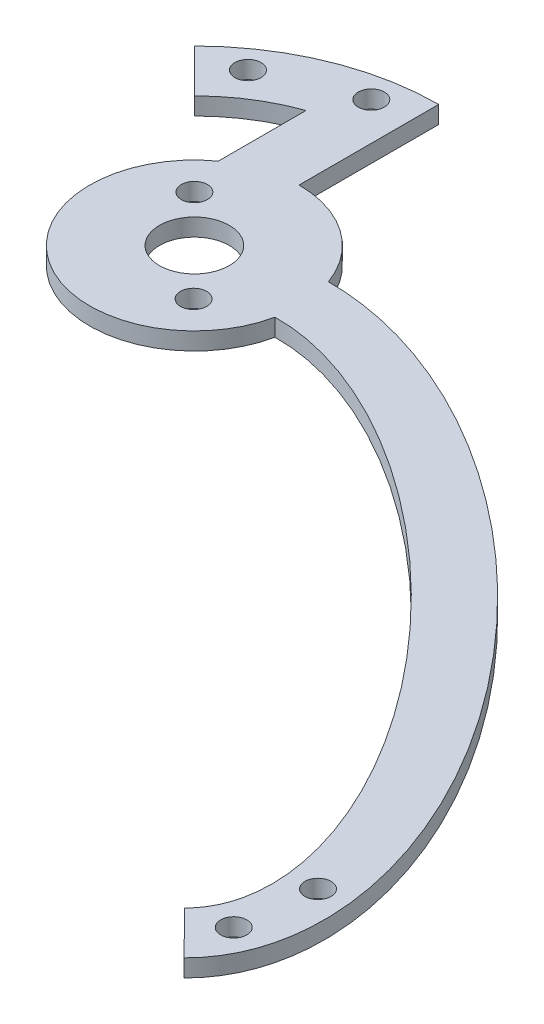
ISO-10303-21;
HEADER;
FILE_DESCRIPTION(('STEP AP214'),'2;1');
FILE_NAME('part.step','',(''),(''),'','','');
FILE_SCHEMA(('AUTOMOTIVE_DESIGN { 1 0 10303 214 1 1 1 1 }'));
ENDSEC;
DATA;
#1=APPLICATION_CONTEXT('core data for automotive mechanical design processes');
#2=APPLICATION_PROTOCOL_DEFINITION('international standard','automotive_design',2000,#1);
#3=PRODUCT_CONTEXT('',#1,'mechanical');
#4=PRODUCT('Part','Part','',(#3));
#5=PRODUCT_RELATED_PRODUCT_CATEGORY('part','',(#4));
#6=PRODUCT_DEFINITION_FORMATION('','',#4);
#7=PRODUCT_DEFINITION_CONTEXT('part definition',#1,'design');
#8=PRODUCT_DEFINITION('design','',#6,#7);
#9=PRODUCT_DEFINITION_SHAPE('','',#8);
#10=(LENGTH_UNIT() NAMED_UNIT(*) SI_UNIT(.MILLI.,.METRE.));
#11=(NAMED_UNIT(*) PLANE_ANGLE_UNIT() SI_UNIT($,.RADIAN.));
#12=(NAMED_UNIT(*) SI_UNIT($,.STERADIAN.) SOLID_ANGLE_UNIT());
#13=UNCERTAINTY_MEASURE_WITH_UNIT(LENGTH_MEASURE(1.E-05),#10,'distance_accuracy_value','');
#14=(GEOMETRIC_REPRESENTATION_CONTEXT(3) GLOBAL_UNCERTAINTY_ASSIGNED_CONTEXT((#13)) GLOBAL_UNIT_ASSIGNED_CONTEXT((#10,
#11,#12)) REPRESENTATION_CONTEXT('',''));
#15=CARTESIAN_POINT('',(0.,0.,0.));
#16=DIRECTION('',(0.,0.,1.));
#17=DIRECTION('',(1.,0.,0.));
#18=AXIS2_PLACEMENT_3D('',#15,#16,#17);
#19=CARTESIAN_POINT('',(35.0561159853547,2.,35.6520508809992));
#20=DIRECTION('',(0.,1.,0.));
#21=DIRECTION('',(0.,0.,1.));
#22=AXIS2_PLACEMENT_3D('',#19,#20,#21);
#23=PLANE('',#22);
#24=CARTESIAN_POINT('',(-14.3394109087762,2.,-20.4788011072248));
#25=DIRECTION('',(0.,1.,0.));
#26=DIRECTION('',(0.,0.,-1.));
#27=AXIS2_PLACEMENT_3D('',#24,#25,#26);
#28=CIRCLE('',#27,1.5);
#29=CARTESIAN_POINT('',(-14.3394109087762,2.,-21.9788011072248));
#30=VERTEX_POINT('',#29);
#31=EDGE_CURVE('E387',#30,#30,#28,.T.);
#32=ORIENTED_EDGE('',*,*,#31,.F.);
#33=EDGE_LOOP('',(#32));
#34=FACE_BOUND('',#33,.T.);
#35=CARTESIAN_POINT('',(70.9506696708395,2.,56.7811169025416));
#36=DIRECTION('',(0.,1.,0.));
#37=DIRECTION('',(0.,0.,1.));
#38=AXIS2_PLACEMENT_3D('',#35,#36,#37);
#39=CIRCLE('',#38,1.5);
#40=CARTESIAN_POINT('',(70.9506696708395,2.,58.2811169025416));
#41=VERTEX_POINT('',#40);
#42=EDGE_CURVE('E381',#41,#41,#39,.T.);
#43=ORIENTED_EDGE('',*,*,#42,.F.);
#44=EDGE_LOOP('',(#43));
#45=FACE_BOUND('',#44,.T.);
#46=CARTESIAN_POINT('',(69.9401108776491,2.,65.4277778192223));
#47=DIRECTION('',(0.,1.,0.));
#48=DIRECTION('',(0.,0.,1.));
#49=AXIS2_PLACEMENT_3D('',#46,#47,#48);
#50=CIRCLE('',#49,1.5);
#51=CARTESIAN_POINT('',(69.9401108776491,2.,66.9277778192223));
#52=VERTEX_POINT('',#51);
#53=EDGE_CURVE('E375',#52,#52,#50,.T.);
#54=ORIENTED_EDGE('',*,*,#53,.F.);
#55=EDGE_LOOP('',(#54));
#56=FACE_BOUND('',#55,.T.);
#57=CARTESIAN_POINT('',(-4.34120444167328,2.,-24.6201938253052));
#58=DIRECTION('',(0.,1.,0.));
#59=DIRECTION('',(0.,0.,1.));
#60=AXIS2_PLACEMENT_3D('',#57,#58,#59);
#61=CIRCLE('',#60,1.5);
#62=CARTESIAN_POINT('',(-4.34120444167328,2.,-23.1201938253052));
#63=VERTEX_POINT('',#62);
#64=EDGE_CURVE('E369',#63,#63,#61,.T.);
#65=ORIENTED_EDGE('',*,*,#64,.F.);
#66=EDGE_LOOP('',(#65));
#67=FACE_BOUND('',#66,.T.);
#68=CARTESIAN_POINT('',(-5.30330085889913,2.,-5.30330085889908));
#69=DIRECTION('',(0.,1.,0.));
#70=DIRECTION('',(0.,0.,1.));
#71=AXIS2_PLACEMENT_3D('',#68,#69,#70);
#72=CIRCLE('',#71,1.5);
#73=CARTESIAN_POINT('',(-5.30330085889913,2.,-3.80330085889908));
#74=VERTEX_POINT('',#73);
#75=EDGE_CURVE('E339',#74,#74,#72,.T.);
#76=ORIENTED_EDGE('',*,*,#75,.F.);
#77=EDGE_LOOP('',(#76));
#78=FACE_BOUND('',#77,.T.);
#79=CARTESIAN_POINT('',(35.0561159853547,2.,35.6520508809992));
#80=DIRECTION('',(0.,-1.,0.));
#81=DIRECTION('',(-0.701122319707094,0.,-0.713041017619985));
#82=AXIS2_PLACEMENT_3D('',#79,#80,#81);
#83=ELLIPSE('',#82,43.,18.);
#84=CARTESIAN_POINT('',(11.7369413109521,2.,2.4988414642121));
#85=VERTEX_POINT('',#84);
#86=CARTESIAN_POINT('',(65.2043757327598,2.,66.3128146386586));
#87=VERTEX_POINT('',#86);
#88=EDGE_CURVE('E165',#85,#87,#83,.T.);
#89=ORIENTED_EDGE('',*,*,#88,.T.);
#90=DIRECTION('',(0.701122319707094,0.,0.713041017619984));
#91=VECTOR('',#90,1.);
#92=CARTESIAN_POINT('',(65.2043757327598,2.,66.3128146386586));
#93=LINE('',#92,#91);
#94=CARTESIAN_POINT('',(70.1122319707094,2.,71.3041017619985));
#95=VERTEX_POINT('',#94);
#96=EDGE_CURVE('E102',#87,#95,#93,.T.);
#97=ORIENTED_EDGE('',*,*,#96,.T.);
#98=CARTESIAN_POINT('',(35.0561159853547,2.,35.6520508809992));
#99=DIRECTION('',(0.,1.,0.));
#100=DIRECTION('',(-0.701122319707094,0.,-0.713041017619985));
#101=AXIS2_PLACEMENT_3D('',#98,#99,#100);
#102=ELLIPSE('',#101,50.,25.);
#103=CARTESIAN_POINT('',(11.2868471693528,2.,-4.07517864340617));
#104=VERTEX_POINT('',#103);
#105=EDGE_CURVE('E186',#95,#104,#102,.T.);
#106=ORIENTED_EDGE('',*,*,#105,.T.);
#107=CARTESIAN_POINT('',(0.,2.,0.));
#108=DIRECTION('',(0.,1.,0.));
#109=DIRECTION('',(0.,0.,1.));
#110=AXIS2_PLACEMENT_3D('',#107,#108,#109);
#111=CIRCLE('',#110,12.);
#112=CARTESIAN_POINT('',(0.,2.,-12.));
#113=VERTEX_POINT('',#112);
#114=EDGE_CURVE('E204',#104,#113,#111,.T.);
#115=ORIENTED_EDGE('',*,*,#114,.T.);
#116=DIRECTION('',(0.,0.,-1.));
#117=VECTOR('',#116,1.);
#118=CARTESIAN_POINT('',(0.,2.,-12.));
#119=LINE('',#118,#117);
#120=CARTESIAN_POINT('',(0.,2.,-28.));
#121=VERTEX_POINT('',#120);
#122=EDGE_CURVE('E201',#113,#121,#119,.T.);
#123=ORIENTED_EDGE('',*,*,#122,.T.);
#124=CARTESIAN_POINT('',(0.,2.,0.));
#125=DIRECTION('',(0.,1.,0.));
#126=DIRECTION('',(0.,0.,1.));
#127=AXIS2_PLACEMENT_3D('',#124,#125,#126);
#128=CIRCLE('',#127,28.);
#129=CARTESIAN_POINT('',(-19.7989898732233,2.,-19.7989898732233));
#130=VERTEX_POINT('',#129);
#131=EDGE_CURVE('E203',#121,#130,#128,.T.);
#132=ORIENTED_EDGE('',*,*,#131,.T.);
#133=DIRECTION('',(0.707106781186536,0.,0.707106781186559));
#134=VECTOR('',#133,1.);
#135=CARTESIAN_POINT('',(-14.8492424049176,2.,-14.8492424049174));
#136=LINE('',#135,#134);
#137=CARTESIAN_POINT('',(-14.8492424049176,2.,-14.8492424049174));
#138=VERTEX_POINT('',#137);
#139=EDGE_CURVE('E127',#130,#138,#136,.T.);
#140=ORIENTED_EDGE('',*,*,#139,.T.);
#141=CARTESIAN_POINT('',(0.,2.,0.));
#142=DIRECTION('',(0.,-1.,0.));
#143=DIRECTION('',(0.,0.,1.));
#144=AXIS2_PLACEMENT_3D('',#141,#142,#143);
#145=CIRCLE('',#144,21.);
#146=CARTESIAN_POINT('',(-7.,2.,-19.7989898732233));
#147=VERTEX_POINT('',#146);
#148=EDGE_CURVE('E121',#138,#147,#145,.T.);
#149=ORIENTED_EDGE('',*,*,#148,.T.);
#150=DIRECTION('',(0.,0.,1.));
#151=VECTOR('',#150,1.);
#152=CARTESIAN_POINT('',(-7.,2.,-19.7989898732233));
#153=LINE('',#152,#151);
#154=CARTESIAN_POINT('',(-7.,2.,-9.74679434480896));
#155=VERTEX_POINT('',#154);
#156=EDGE_CURVE('E125',#147,#155,#153,.T.);
#157=ORIENTED_EDGE('',*,*,#156,.T.);
#158=CARTESIAN_POINT('',(0.,2.,0.));
#159=DIRECTION('',(0.,1.,0.));
#160=DIRECTION('',(0.,0.,1.));
#161=AXIS2_PLACEMENT_3D('',#158,#159,#160);
#162=CIRCLE('',#161,12.);
#163=EDGE_CURVE('E53',#155,#85,#162,.T.);
#164=ORIENTED_EDGE('',*,*,#163,.T.);
#165=EDGE_LOOP('',(#89,#97,#106,#115,#123,#132,#140,#149,#157,#164));
#166=FACE_BOUND('',#165,.T.);
#167=CARTESIAN_POINT('',(0.,2.,0.));
#168=DIRECTION('',(0.,1.,0.));
#169=DIRECTION('',(0.,0.,1.));
#170=AXIS2_PLACEMENT_3D('',#167,#168,#169);
#171=CIRCLE('',#170,4.);
#172=CARTESIAN_POINT('',(0.,2.,4.));
#173=VERTEX_POINT('',#172);
#174=EDGE_CURVE('E149',#173,#173,#171,.T.);
#175=ORIENTED_EDGE('',*,*,#174,.F.);
#176=EDGE_LOOP('',(#175));
#177=FACE_BOUND('',#176,.T.);
#178=CARTESIAN_POINT('',(5.2584173978032,2.,5.34780763214988));
#179=DIRECTION('',(0.,1.,0.));
#180=DIRECTION('',(0.,0.,1.));
#181=AXIS2_PLACEMENT_3D('',#178,#179,#180);
#182=CIRCLE('',#181,1.5);
#183=CARTESIAN_POINT('',(5.2584173978032,2.,6.84780763214988));
#184=VERTEX_POINT('',#183);
#185=EDGE_CURVE('E344',#184,#184,#182,.T.);
#186=ORIENTED_EDGE('',*,*,#185,.F.);
#187=EDGE_LOOP('',(#186));
#188=FACE_BOUND('',#187,.T.);
#189=ADVANCED_FACE('F35',(#34,#45,#56,#67,#78,#166,#177,#188),#23,.T.);
#190=CARTESIAN_POINT('',(35.0561159853547,0.,35.6520508809992));
#191=DIRECTION('',(0.,1.,0.));
#192=DIRECTION('',(0.,0.,1.));
#193=AXIS2_PLACEMENT_3D('',#190,#191,#192);
#194=PLANE('',#193);
#195=CARTESIAN_POINT('',(-14.3394109087762,0.,-20.4788011072248));
#196=DIRECTION('',(0.,1.,0.));
#197=DIRECTION('',(0.,0.,-1.));
#198=AXIS2_PLACEMENT_3D('',#195,#196,#197);
#199=CIRCLE('',#198,1.5);
#200=CARTESIAN_POINT('',(-14.3394109087762,0.,-21.9788011072248));
#201=VERTEX_POINT('',#200);
#202=EDGE_CURVE('E373',#201,#201,#199,.T.);
#203=ORIENTED_EDGE('',*,*,#202,.T.);
#204=EDGE_LOOP('',(#203));
#205=FACE_BOUND('',#204,.T.);
#206=CARTESIAN_POINT('',(70.9506696708395,0.,56.7811169025416));
#207=DIRECTION('',(0.,1.,0.));
#208=DIRECTION('',(0.,0.,1.));
#209=AXIS2_PLACEMENT_3D('',#206,#207,#208);
#210=CIRCLE('',#209,1.5);
#211=CARTESIAN_POINT('',(70.9506696708395,0.,58.2811169025416));
#212=VERTEX_POINT('',#211);
#213=EDGE_CURVE('E384',#212,#212,#210,.T.);
#214=ORIENTED_EDGE('',*,*,#213,.T.);
#215=EDGE_LOOP('',(#214));
#216=FACE_BOUND('',#215,.T.);
#217=CARTESIAN_POINT('',(69.9401108776491,0.,65.4277778192223));
#218=DIRECTION('',(0.,1.,0.));
#219=DIRECTION('',(0.,0.,1.));
#220=AXIS2_PLACEMENT_3D('',#217,#218,#219);
#221=CIRCLE('',#220,1.5);
#222=CARTESIAN_POINT('',(69.9401108776491,0.,66.9277778192223));
#223=VERTEX_POINT('',#222);
#224=EDGE_CURVE('E378',#223,#223,#221,.T.);
#225=ORIENTED_EDGE('',*,*,#224,.T.);
#226=EDGE_LOOP('',(#225));
#227=FACE_BOUND('',#226,.T.);
#228=CARTESIAN_POINT('',(-4.34120444167328,0.,-24.6201938253052));
#229=DIRECTION('',(0.,1.,0.));
#230=DIRECTION('',(0.,0.,1.));
#231=AXIS2_PLACEMENT_3D('',#228,#229,#230);
#232=CIRCLE('',#231,1.5);
#233=CARTESIAN_POINT('',(-4.34120444167328,0.,-23.1201938253052));
#234=VERTEX_POINT('',#233);
#235=EDGE_CURVE('E367',#234,#234,#232,.T.);
#236=ORIENTED_EDGE('',*,*,#235,.T.);
#237=EDGE_LOOP('',(#236));
#238=FACE_BOUND('',#237,.T.);
#239=CARTESIAN_POINT('',(35.0561159853547,0.,35.6520508809992));
#240=DIRECTION('',(0.,-1.,0.));
#241=DIRECTION('',(-0.701122319707094,0.,-0.713041017619985));
#242=AXIS2_PLACEMENT_3D('',#239,#240,#241);
#243=ELLIPSE('',#242,43.,18.);
#244=CARTESIAN_POINT('',(11.7369413109521,0.,2.4988414642121));
#245=VERTEX_POINT('',#244);
#246=CARTESIAN_POINT('',(65.2043757327598,0.,66.3128146386586));
#247=VERTEX_POINT('',#246);
#248=EDGE_CURVE('E145',#245,#247,#243,.T.);
#249=ORIENTED_EDGE('',*,*,#248,.F.);
#250=CARTESIAN_POINT('',(0.,0.,0.));
#251=DIRECTION('',(0.,1.,0.));
#252=DIRECTION('',(0.,0.,1.));
#253=AXIS2_PLACEMENT_3D('',#250,#251,#252);
#254=CIRCLE('',#253,12.);
#255=CARTESIAN_POINT('',(-7.,0.,-9.74679434480896));
#256=VERTEX_POINT('',#255);
#257=EDGE_CURVE('E94',#256,#245,#254,.T.);
#258=ORIENTED_EDGE('',*,*,#257,.F.);
#259=DIRECTION('',(0.,0.,1.));
#260=VECTOR('',#259,1.);
#261=CARTESIAN_POINT('',(-7.,0.,-19.7989898732233));
#262=LINE('',#261,#260);
#263=CARTESIAN_POINT('',(-7.,0.,-19.7989898732233));
#264=VERTEX_POINT('',#263);
#265=EDGE_CURVE('E88',#264,#256,#262,.T.);
#266=ORIENTED_EDGE('',*,*,#265,.F.);
#267=CARTESIAN_POINT('',(0.,0.,0.));
#268=DIRECTION('',(0.,-1.,0.));
#269=DIRECTION('',(0.,0.,1.));
#270=AXIS2_PLACEMENT_3D('',#267,#268,#269);
#271=CIRCLE('',#270,21.);
#272=CARTESIAN_POINT('',(-14.8492424049176,0.,-14.8492424049174));
#273=VERTEX_POINT('',#272);
#274=EDGE_CURVE('E135',#273,#264,#271,.T.);
#275=ORIENTED_EDGE('',*,*,#274,.F.);
#276=DIRECTION('',(0.707106781186536,0.,0.707106781186559));
#277=VECTOR('',#276,1.);
#278=CARTESIAN_POINT('',(-14.8492424049176,0.,-14.8492424049174));
#279=LINE('',#278,#277);
#280=CARTESIAN_POINT('',(-19.7989898732233,0.,-19.7989898732233));
#281=VERTEX_POINT('',#280);
#282=EDGE_CURVE('E160',#281,#273,#279,.T.);
#283=ORIENTED_EDGE('',*,*,#282,.F.);
#284=CARTESIAN_POINT('',(0.,0.,0.));
#285=DIRECTION('',(0.,1.,0.));
#286=DIRECTION('',(0.,0.,1.));
#287=AXIS2_PLACEMENT_3D('',#284,#285,#286);
#288=CIRCLE('',#287,28.);
#289=CARTESIAN_POINT('',(0.,0.,-28.));
#290=VERTEX_POINT('',#289);
#291=EDGE_CURVE('E158',#290,#281,#288,.T.);
#292=ORIENTED_EDGE('',*,*,#291,.F.);
#293=DIRECTION('',(0.,0.,-1.));
#294=VECTOR('',#293,1.);
#295=CARTESIAN_POINT('',(0.,0.,-22.));
#296=LINE('',#295,#294);
#297=CARTESIAN_POINT('',(0.,0.,-12.));
#298=VERTEX_POINT('',#297);
#299=EDGE_CURVE('E156',#298,#290,#296,.T.);
#300=ORIENTED_EDGE('',*,*,#299,.F.);
#301=CARTESIAN_POINT('',(0.,0.,0.));
#302=DIRECTION('',(0.,1.,0.));
#303=DIRECTION('',(0.,0.,1.));
#304=AXIS2_PLACEMENT_3D('',#301,#302,#303);
#305=CIRCLE('',#304,12.);
#306=CARTESIAN_POINT('',(11.2868471693528,0.,-4.07517864340617));
#307=VERTEX_POINT('',#306);
#308=EDGE_CURVE('E153',#307,#298,#305,.T.);
#309=ORIENTED_EDGE('',*,*,#308,.F.);
#310=CARTESIAN_POINT('',(35.0561159853547,0.,35.6520508809992));
#311=DIRECTION('',(0.,1.,0.));
#312=DIRECTION('',(-0.701122319707094,0.,-0.713041017619985));
#313=AXIS2_PLACEMENT_3D('',#310,#311,#312);
#314=ELLIPSE('',#313,50.,25.);
#315=CARTESIAN_POINT('',(70.1122319707094,0.,71.3041017619985));
#316=VERTEX_POINT('',#315);
#317=EDGE_CURVE('E151',#316,#307,#314,.T.);
#318=ORIENTED_EDGE('',*,*,#317,.F.);
#319=DIRECTION('',(0.701122319707094,0.,0.713041017619984));
#320=VECTOR('',#319,1.);
#321=CARTESIAN_POINT('',(65.2043757327598,0.,66.3128146386586));
#322=LINE('',#321,#320);
#323=EDGE_CURVE('E148',#247,#316,#322,.T.);
#324=ORIENTED_EDGE('',*,*,#323,.F.);
#325=EDGE_LOOP('',(#249,#258,#266,#275,#283,#292,#300,#309,#318,#324));
#326=FACE_BOUND('',#325,.T.);
#327=CARTESIAN_POINT('',(0.,0.,0.));
#328=DIRECTION('',(0.,1.,0.));
#329=DIRECTION('',(0.,0.,1.));
#330=AXIS2_PLACEMENT_3D('',#327,#328,#329);
#331=CIRCLE('',#330,4.);
#332=CARTESIAN_POINT('',(0.,0.,4.));
#333=VERTEX_POINT('',#332);
#334=EDGE_CURVE('E346',#333,#333,#331,.T.);
#335=ORIENTED_EDGE('',*,*,#334,.T.);
#336=EDGE_LOOP('',(#335));
#337=FACE_BOUND('',#336,.T.);
#338=CARTESIAN_POINT('',(-5.30330085889913,0.,-5.30330085889908));
#339=DIRECTION('',(0.,1.,0.));
#340=DIRECTION('',(0.,0.,1.));
#341=AXIS2_PLACEMENT_3D('',#338,#339,#340);
#342=CIRCLE('',#341,1.5);
#343=CARTESIAN_POINT('',(-5.30330085889913,0.,-3.80330085889908));
#344=VERTEX_POINT('',#343);
#345=EDGE_CURVE('E342',#344,#344,#342,.T.);
#346=ORIENTED_EDGE('',*,*,#345,.T.);
#347=EDGE_LOOP('',(#346));
#348=FACE_BOUND('',#347,.T.);
#349=CARTESIAN_POINT('',(5.2584173978032,0.,5.34780763214988));
#350=DIRECTION('',(0.,1.,0.));
#351=DIRECTION('',(0.,0.,1.));
#352=AXIS2_PLACEMENT_3D('',#349,#350,#351);
#353=CIRCLE('',#352,1.5);
#354=CARTESIAN_POINT('',(5.2584173978032,0.,6.84780763214988));
#355=VERTEX_POINT('',#354);
#356=EDGE_CURVE('E349',#355,#355,#353,.T.);
#357=ORIENTED_EDGE('',*,*,#356,.T.);
#358=EDGE_LOOP('',(#357));
#359=FACE_BOUND('',#358,.T.);
#360=ADVANCED_FACE('F190',(#205,#216,#227,#238,#326,#337,#348,#359),#194,.F.);
#361=DIRECTION('',(0.,-1.,0.));
#362=VECTOR('',#361,1.);
#363=SURFACE_OF_LINEAR_EXTRUSION('',#83,#362);
#364=ORIENTED_EDGE('',*,*,#248,.T.);
#365=DIRECTION('',(0.,-1.,0.));
#366=VECTOR('',#365,1.);
#367=CARTESIAN_POINT('',(65.2043757327598,2.,66.3128146386586));
#368=LINE('',#367,#366);
#369=EDGE_CURVE('E11',#87,#247,#368,.T.);
#370=ORIENTED_EDGE('',*,*,#369,.F.);
#371=ORIENTED_EDGE('',*,*,#88,.F.);
#372=DIRECTION('',(0.,-1.,0.));
#373=VECTOR('',#372,1.);
#374=CARTESIAN_POINT('',(11.7369413109521,2.,2.4988414642121));
#375=LINE('',#374,#373);
#376=EDGE_CURVE('E141',#85,#245,#375,.T.);
#377=ORIENTED_EDGE('',*,*,#376,.T.);
#378=EDGE_LOOP('',(#364,#370,#371,#377));
#379=FACE_BOUND('',#378,.T.);
#380=ADVANCED_FACE('F37',(#379),#363,.F.);
#381=CARTESIAN_POINT('',(65.2043757327598,2.,66.3128146386586));
#382=DIRECTION('',(0.713041017619984,0.,-0.701122319707095));
#383=DIRECTION('',(-0.701122319707095,0.,-0.713041017619984));
#384=AXIS2_PLACEMENT_3D('',#381,#382,#383);
#385=PLANE('',#384);
#386=ORIENTED_EDGE('',*,*,#323,.T.);
#387=DIRECTION('',(0.,-1.,0.));
#388=VECTOR('',#387,1.);
#389=CARTESIAN_POINT('',(70.1122319707094,2.,71.3041017619985));
#390=LINE('',#389,#388);
#391=EDGE_CURVE('E45',#95,#316,#390,.T.);
#392=ORIENTED_EDGE('',*,*,#391,.F.);
#393=ORIENTED_EDGE('',*,*,#96,.F.);
#394=ORIENTED_EDGE('',*,*,#369,.T.);
#395=EDGE_LOOP('',(#386,#392,#393,#394));
#396=FACE_BOUND('',#395,.T.);
#397=ADVANCED_FACE('F214',(#396),#385,.F.);
#398=DIRECTION('',(0.,-1.,0.));
#399=VECTOR('',#398,1.);
#400=SURFACE_OF_LINEAR_EXTRUSION('',#102,#399);
#401=ORIENTED_EDGE('',*,*,#317,.T.);
#402=DIRECTION('',(0.,-1.,0.));
#403=VECTOR('',#402,1.);
#404=CARTESIAN_POINT('',(11.2868471693528,2.,-4.07517864340617));
#405=LINE('',#404,#403);
#406=EDGE_CURVE('E178',#104,#307,#405,.T.);
#407=ORIENTED_EDGE('',*,*,#406,.F.);
#408=ORIENTED_EDGE('',*,*,#105,.F.);
#409=ORIENTED_EDGE('',*,*,#391,.T.);
#410=EDGE_LOOP('',(#401,#407,#408,#409));
#411=FACE_BOUND('',#410,.T.);
#412=ADVANCED_FACE('F184',(#411),#400,.F.);
#413=CARTESIAN_POINT('',(0.,2.,0.));
#414=DIRECTION('',(0.,-1.,0.));
#415=DIRECTION('',(0.,0.,-1.));
#416=AXIS2_PLACEMENT_3D('',#413,#414,#415);
#417=CYLINDRICAL_SURFACE('',#416,12.);
#418=ORIENTED_EDGE('',*,*,#308,.T.);
#419=DIRECTION('',(0.,-1.,0.));
#420=VECTOR('',#419,1.);
#421=CARTESIAN_POINT('',(0.,2.,-12.));
#422=LINE('',#421,#420);
#423=EDGE_CURVE('E175',#113,#298,#422,.T.);
#424=ORIENTED_EDGE('',*,*,#423,.F.);
#425=ORIENTED_EDGE('',*,*,#114,.F.);
#426=ORIENTED_EDGE('',*,*,#406,.T.);
#427=EDGE_LOOP('',(#418,#424,#425,#426));
#428=FACE_BOUND('',#427,.T.);
#429=ADVANCED_FACE('F195',(#428),#417,.T.);
#430=CARTESIAN_POINT('',(0.,2.,-22.));
#431=DIRECTION('',(-1.,0.,0.));
#432=DIRECTION('',(0.,0.,1.));
#433=AXIS2_PLACEMENT_3D('',#430,#431,#432);
#434=PLANE('',#433);
#435=ORIENTED_EDGE('',*,*,#299,.T.);
#436=DIRECTION('',(0.,-1.,0.));
#437=VECTOR('',#436,1.);
#438=CARTESIAN_POINT('',(0.,2.,-28.));
#439=LINE('',#438,#437);
#440=EDGE_CURVE('E172',#121,#290,#439,.T.);
#441=ORIENTED_EDGE('',*,*,#440,.F.);
#442=ORIENTED_EDGE('',*,*,#122,.F.);
#443=ORIENTED_EDGE('',*,*,#423,.T.);
#444=EDGE_LOOP('',(#435,#441,#442,#443));
#445=FACE_BOUND('',#444,.T.);
#446=ADVANCED_FACE('F199',(#445),#434,.F.);
#447=CARTESIAN_POINT('',(0.,2.,0.));
#448=DIRECTION('',(0.,-1.,0.));
#449=DIRECTION('',(0.,0.,-1.));
#450=AXIS2_PLACEMENT_3D('',#447,#448,#449);
#451=CYLINDRICAL_SURFACE('',#450,28.);
#452=ORIENTED_EDGE('',*,*,#291,.T.);
#453=DIRECTION('',(0.,-1.,0.));
#454=VECTOR('',#453,1.);
#455=CARTESIAN_POINT('',(-19.7989898732233,2.,-19.7989898732233));
#456=LINE('',#455,#454);
#457=EDGE_CURVE('E169',#130,#281,#456,.T.);
#458=ORIENTED_EDGE('',*,*,#457,.F.);
#459=ORIENTED_EDGE('',*,*,#131,.F.);
#460=ORIENTED_EDGE('',*,*,#440,.T.);
#461=EDGE_LOOP('',(#452,#458,#459,#460));
#462=FACE_BOUND('',#461,.T.);
#463=ADVANCED_FACE('F245',(#462),#451,.T.);
#464=CARTESIAN_POINT('',(-14.8492424049176,2.,-14.8492424049174));
#465=DIRECTION('',(0.707106781186559,0.,-0.707106781186536));
#466=DIRECTION('',(-0.707106781186536,0.,-0.707106781186559));
#467=AXIS2_PLACEMENT_3D('',#464,#465,#466);
#468=PLANE('',#467);
#469=ORIENTED_EDGE('',*,*,#282,.T.);
#470=DIRECTION('',(0.,-1.,0.));
#471=VECTOR('',#470,1.);
#472=CARTESIAN_POINT('',(-14.8492424049176,2.,-14.8492424049174));
#473=LINE('',#472,#471);
#474=EDGE_CURVE('E136',#138,#273,#473,.T.);
#475=ORIENTED_EDGE('',*,*,#474,.F.);
#476=ORIENTED_EDGE('',*,*,#139,.F.);
#477=ORIENTED_EDGE('',*,*,#457,.T.);
#478=EDGE_LOOP('',(#469,#475,#476,#477));
#479=FACE_BOUND('',#478,.T.);
#480=ADVANCED_FACE('F242',(#479),#468,.F.);
#481=CARTESIAN_POINT('',(0.,2.,0.));
#482=DIRECTION('',(0.,-1.,0.));
#483=DIRECTION('',(0.,0.,-1.));
#484=AXIS2_PLACEMENT_3D('',#481,#482,#483);
#485=CYLINDRICAL_SURFACE('',#484,21.);
#486=ORIENTED_EDGE('',*,*,#274,.T.);
#487=DIRECTION('',(0.,-1.,0.));
#488=VECTOR('',#487,1.);
#489=CARTESIAN_POINT('',(-7.,2.,-19.7989898732233));
#490=LINE('',#489,#488);
#491=EDGE_CURVE('E132',#147,#264,#490,.T.);
#492=ORIENTED_EDGE('',*,*,#491,.F.);
#493=ORIENTED_EDGE('',*,*,#148,.F.);
#494=ORIENTED_EDGE('',*,*,#474,.T.);
#495=EDGE_LOOP('',(#486,#492,#493,#494));
#496=FACE_BOUND('',#495,.T.);
#497=ADVANCED_FACE('F133',(#496),#485,.F.);
#498=CARTESIAN_POINT('',(-7.,2.,-19.7989898732233));
#499=DIRECTION('',(1.,0.,0.));
#500=DIRECTION('',(0.,0.,-1.));
#501=AXIS2_PLACEMENT_3D('',#498,#499,#500);
#502=PLANE('',#501);
#503=ORIENTED_EDGE('',*,*,#265,.T.);
#504=DIRECTION('',(0.,-1.,0.));
#505=VECTOR('',#504,1.);
#506=CARTESIAN_POINT('',(-7.,2.,-9.74679434480896));
#507=LINE('',#506,#505);
#508=EDGE_CURVE('E137',#155,#256,#507,.T.);
#509=ORIENTED_EDGE('',*,*,#508,.F.);
#510=ORIENTED_EDGE('',*,*,#156,.F.);
#511=ORIENTED_EDGE('',*,*,#491,.T.);
#512=EDGE_LOOP('',(#503,#509,#510,#511));
#513=FACE_BOUND('',#512,.T.);
#514=ADVANCED_FACE('F139',(#513),#502,.F.);
#515=CARTESIAN_POINT('',(0.,2.,0.));
#516=DIRECTION('',(0.,-1.,0.));
#517=DIRECTION('',(0.,0.,-1.));
#518=AXIS2_PLACEMENT_3D('',#515,#516,#517);
#519=CYLINDRICAL_SURFACE('',#518,12.);
#520=ORIENTED_EDGE('',*,*,#257,.T.);
#521=ORIENTED_EDGE('',*,*,#376,.F.);
#522=ORIENTED_EDGE('',*,*,#163,.F.);
#523=ORIENTED_EDGE('',*,*,#508,.T.);
#524=EDGE_LOOP('',(#520,#521,#522,#523));
#525=FACE_BOUND('',#524,.T.);
#526=ADVANCED_FACE('F235',(#525),#519,.T.);
#527=CARTESIAN_POINT('',(0.,2.,0.));
#528=DIRECTION('',(0.,-1.,0.));
#529=DIRECTION('',(0.,0.,-1.));
#530=AXIS2_PLACEMENT_3D('',#527,#528,#529);
#531=CYLINDRICAL_SURFACE('',#530,4.);
#532=ORIENTED_EDGE('',*,*,#174,.T.);
#533=EDGE_LOOP('',(#532));
#534=FACE_BOUND('',#533,.T.);
#535=ORIENTED_EDGE('',*,*,#334,.F.);
#536=EDGE_LOOP('',(#535));
#537=FACE_BOUND('',#536,.T.);
#538=ADVANCED_FACE('F232',(#534,#537),#531,.F.);
#539=CARTESIAN_POINT('',(-5.30330085889913,2.,-5.30330085889908));
#540=DIRECTION('',(0.,-1.,0.));
#541=DIRECTION('',(0.,0.,-1.));
#542=AXIS2_PLACEMENT_3D('',#539,#540,#541);
#543=CYLINDRICAL_SURFACE('',#542,1.5);
#544=ORIENTED_EDGE('',*,*,#75,.T.);
#545=EDGE_LOOP('',(#544));
#546=FACE_BOUND('',#545,.T.);
#547=ORIENTED_EDGE('',*,*,#345,.F.);
#548=EDGE_LOOP('',(#547));
#549=FACE_BOUND('',#548,.T.);
#550=ADVANCED_FACE('F328',(#546,#549),#543,.F.);
#551=CARTESIAN_POINT('',(5.2584173978032,2.,5.34780763214988));
#552=DIRECTION('',(0.,-1.,0.));
#553=DIRECTION('',(0.,0.,-1.));
#554=AXIS2_PLACEMENT_3D('',#551,#552,#553);
#555=CYLINDRICAL_SURFACE('',#554,1.5);
#556=ORIENTED_EDGE('',*,*,#185,.T.);
#557=EDGE_LOOP('',(#556));
#558=FACE_BOUND('',#557,.T.);
#559=ORIENTED_EDGE('',*,*,#356,.F.);
#560=EDGE_LOOP('',(#559));
#561=FACE_BOUND('',#560,.T.);
#562=ADVANCED_FACE('F289',(#558,#561),#555,.F.);
#563=CARTESIAN_POINT('',(-4.34120444167328,0.,-24.6201938253052));
#564=DIRECTION('',(0.,1.,0.));
#565=DIRECTION('',(0.,0.,1.));
#566=AXIS2_PLACEMENT_3D('',#563,#564,#565);
#567=CYLINDRICAL_SURFACE('',#566,1.5);
#568=ORIENTED_EDGE('',*,*,#235,.F.);
#569=EDGE_LOOP('',(#568));
#570=FACE_BOUND('',#569,.T.);
#571=ORIENTED_EDGE('',*,*,#64,.T.);
#572=EDGE_LOOP('',(#571));
#573=FACE_BOUND('',#572,.T.);
#574=ADVANCED_FACE('F283',(#570,#573),#567,.F.);
#575=CARTESIAN_POINT('',(69.9401108776491,0.,65.4277778192223));
#576=DIRECTION('',(0.,1.,0.));
#577=DIRECTION('',(0.,0.,1.));
#578=AXIS2_PLACEMENT_3D('',#575,#576,#577);
#579=CYLINDRICAL_SURFACE('',#578,1.5);
#580=ORIENTED_EDGE('',*,*,#224,.F.);
#581=EDGE_LOOP('',(#580));
#582=FACE_BOUND('',#581,.T.);
#583=ORIENTED_EDGE('',*,*,#53,.T.);
#584=EDGE_LOOP('',(#583));
#585=FACE_BOUND('',#584,.T.);
#586=ADVANCED_FACE('F288',(#582,#585),#579,.F.);
#587=CARTESIAN_POINT('',(70.9506696708395,0.,56.7811169025416));
#588=DIRECTION('',(0.,1.,0.));
#589=DIRECTION('',(0.,0.,1.));
#590=AXIS2_PLACEMENT_3D('',#587,#588,#589);
#591=CYLINDRICAL_SURFACE('',#590,1.5);
#592=ORIENTED_EDGE('',*,*,#213,.F.);
#593=EDGE_LOOP('',(#592));
#594=FACE_BOUND('',#593,.T.);
#595=ORIENTED_EDGE('',*,*,#42,.T.);
#596=EDGE_LOOP('',(#595));
#597=FACE_BOUND('',#596,.T.);
#598=ADVANCED_FACE('F301',(#594,#597),#591,.F.);
#599=CARTESIAN_POINT('',(-14.3394109087762,0.,-20.4788011072248));
#600=DIRECTION('',(0.,1.,0.));
#601=DIRECTION('',(0.,0.,1.));
#602=AXIS2_PLACEMENT_3D('',#599,#600,#601);
#603=CYLINDRICAL_SURFACE('',#602,1.5);
#604=ORIENTED_EDGE('',*,*,#202,.F.);
#605=EDGE_LOOP('',(#604));
#606=FACE_BOUND('',#605,.T.);
#607=ORIENTED_EDGE('',*,*,#31,.T.);
#608=EDGE_LOOP('',(#607));
#609=FACE_BOUND('',#608,.T.);
#610=ADVANCED_FACE('F311',(#606,#609),#603,.F.);
#611=CLOSED_SHELL('',(#189,#360,#380,#397,#412,#429,#446,#463,#480,#497,#514,#526,#538,#550,
#562,#574,#586,#598,#610));
#612=MANIFOLD_SOLID_BREP('B2',#611);
#613=ADVANCED_BREP_SHAPE_REPRESENTATION('',(#18,#612),#14);
#614=SHAPE_DEFINITION_REPRESENTATION(#9,#613);
ENDSEC;
END-ISO-10303-21;
